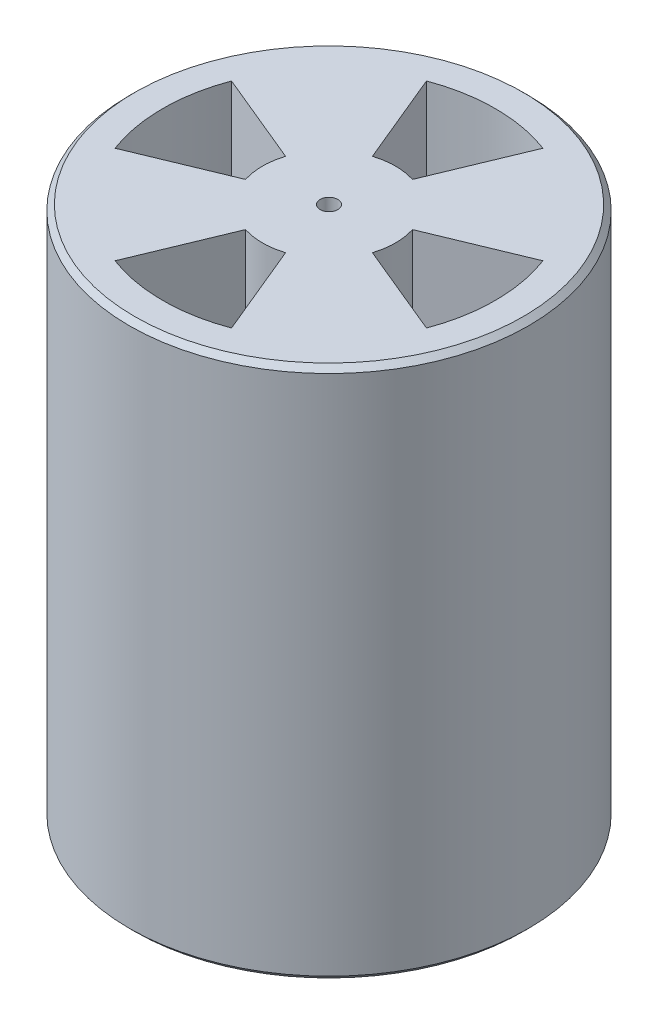
ISO-10303-21;
HEADER;
FILE_DESCRIPTION(('STEP AP214'),'2;1');
FILE_NAME('part.step','',(''),(''),'','','');
FILE_SCHEMA(('AUTOMOTIVE_DESIGN { 1 0 10303 214 1 1 1 1 }'));
ENDSEC;
DATA;
#1=APPLICATION_CONTEXT('core data for automotive mechanical design processes');
#2=APPLICATION_PROTOCOL_DEFINITION('international standard','automotive_design',2000,#1);
#3=PRODUCT_CONTEXT('',#1,'mechanical');
#4=PRODUCT('Part','Part','',(#3));
#5=PRODUCT_RELATED_PRODUCT_CATEGORY('part','',(#4));
#6=PRODUCT_DEFINITION_FORMATION('','',#4);
#7=PRODUCT_DEFINITION_CONTEXT('part definition',#1,'design');
#8=PRODUCT_DEFINITION('design','',#6,#7);
#9=PRODUCT_DEFINITION_SHAPE('','',#8);
#10=(LENGTH_UNIT() NAMED_UNIT(*) SI_UNIT(.MILLI.,.METRE.));
#11=(NAMED_UNIT(*) PLANE_ANGLE_UNIT() SI_UNIT($,.RADIAN.));
#12=(NAMED_UNIT(*) SI_UNIT($,.STERADIAN.) SOLID_ANGLE_UNIT());
#13=UNCERTAINTY_MEASURE_WITH_UNIT(LENGTH_MEASURE(1.E-05),#10,'distance_accuracy_value','');
#14=(GEOMETRIC_REPRESENTATION_CONTEXT(3) GLOBAL_UNCERTAINTY_ASSIGNED_CONTEXT((#13)) GLOBAL_UNIT_ASSIGNED_CONTEXT((#10,
#11,#12)) REPRESENTATION_CONTEXT('',''));
#15=CARTESIAN_POINT('',(0.,0.,0.));
#16=DIRECTION('',(0.,0.,1.));
#17=DIRECTION('',(1.,0.,0.));
#18=AXIS2_PLACEMENT_3D('',#15,#16,#17);
#19=CARTESIAN_POINT('',(0.,203.2,0.));
#20=DIRECTION('',(0.,1.,0.));
#21=DIRECTION('',(0.,0.,1.));
#22=AXIS2_PLACEMENT_3D('',#19,#20,#21);
#23=CYLINDRICAL_SURFACE('',#22,3.37819999999997);
#24=CARTESIAN_POINT('',(0.,203.2,0.));
#25=DIRECTION('',(0.,1.,0.));
#26=DIRECTION('',(0.,0.,1.));
#27=AXIS2_PLACEMENT_3D('',#24,#25,#26);
#28=CIRCLE('',#27,3.37819999999999);
#29=CARTESIAN_POINT('',(0.,203.2,3.37819999999999));
#30=VERTEX_POINT('',#29);
#31=EDGE_CURVE('E178',#30,#30,#28,.T.);
#32=ORIENTED_EDGE('',*,*,#31,.T.);
#33=EDGE_LOOP('',(#32));
#34=FACE_BOUND('',#33,.T.);
#35=CARTESIAN_POINT('',(0.,15.875,0.));
#36=DIRECTION('',(0.,-1.,0.));
#37=DIRECTION('',(0.,0.,-1.));
#38=AXIS2_PLACEMENT_3D('',#35,#36,#37);
#39=CIRCLE('',#38,3.37819999999997);
#40=CARTESIAN_POINT('',(0.,15.875,-3.37819999999997));
#41=VERTEX_POINT('',#40);
#42=EDGE_CURVE('E176',#41,#41,#39,.F.);
#43=ORIENTED_EDGE('',*,*,#42,.F.);
#44=EDGE_LOOP('',(#43));
#45=FACE_BOUND('',#44,.T.);
#46=ADVANCED_FACE('F40',(#34,#45),#23,.F.);
#47=CARTESIAN_POINT('',(0.,203.2,0.));
#48=DIRECTION('',(0.,-1.,0.));
#49=DIRECTION('',(0.,0.,-1.));
#50=AXIS2_PLACEMENT_3D('',#47,#48,#49);
#51=CYLINDRICAL_SURFACE('',#50,76.1365);
#52=CARTESIAN_POINT('',(0.,2.03199999999998,0.));
#53=DIRECTION('',(0.,1.,0.));
#54=DIRECTION('',(0.,0.,1.));
#55=AXIS2_PLACEMENT_3D('',#52,#53,#54);
#56=CIRCLE('',#55,76.1365);
#57=CARTESIAN_POINT('',(0.,2.03199999999998,76.1365));
#58=VERTEX_POINT('',#57);
#59=EDGE_CURVE('E190',#58,#58,#56,.T.);
#60=ORIENTED_EDGE('',*,*,#59,.T.);
#61=EDGE_LOOP('',(#60));
#62=FACE_BOUND('',#61,.T.);
#63=CARTESIAN_POINT('',(0.,201.168,0.));
#64=DIRECTION('',(0.,1.,0.));
#65=DIRECTION('',(0.,0.,1.));
#66=AXIS2_PLACEMENT_3D('',#63,#64,#65);
#67=CIRCLE('',#66,76.1365);
#68=CARTESIAN_POINT('',(0.,201.168,76.1365));
#69=VERTEX_POINT('',#68);
#70=EDGE_CURVE('E175',#69,#69,#67,.F.);
#71=ORIENTED_EDGE('',*,*,#70,.T.);
#72=EDGE_LOOP('',(#71));
#73=FACE_BOUND('',#72,.T.);
#74=ADVANCED_FACE('F280',(#62,#73),#51,.T.);
#75=CARTESIAN_POINT('',(0.,203.2,0.));
#76=DIRECTION('',(0.,1.,0.));
#77=DIRECTION('',(0.,0.,1.));
#78=AXIS2_PLACEMENT_3D('',#75,#76,#77);
#79=PLANE('',#78);
#80=ORIENTED_EDGE('',*,*,#31,.F.);
#81=EDGE_LOOP('',(#80));
#82=FACE_BOUND('',#81,.T.);
#83=CARTESIAN_POINT('',(0.,203.2,0.));
#84=DIRECTION('',(0.,1.,0.));
#85=DIRECTION('',(0.,0.,1.));
#86=AXIS2_PLACEMENT_3D('',#83,#84,#85);
#87=CIRCLE('',#86,25.4);
#88=CARTESIAN_POINT('',(-7.64705119977545,203.2,-24.2215319075407));
#89=VERTEX_POINT('',#88);
#90=CARTESIAN_POINT('',(7.64705119977543,203.2,-24.2215319075407));
#91=VERTEX_POINT('',#90);
#92=EDGE_CURVE('E173',#89,#91,#87,.F.);
#93=ORIENTED_EDGE('',*,*,#92,.F.);
#94=DIRECTION('',(0.38268343236509,0.,0.923879532511287));
#95=VECTOR('',#94,1.);
#96=CARTESIAN_POINT('',(-7.64705119977545,203.2,-24.2215319075407));
#97=LINE('',#96,#95);
#98=CARTESIAN_POINT('',(-22.225,203.2,-59.4158136126234));
#99=VERTEX_POINT('',#98);
#100=EDGE_CURVE('E85',#99,#89,#97,.T.);
#101=ORIENTED_EDGE('',*,*,#100,.F.);
#102=CARTESIAN_POINT('',(0.,203.2,0.));
#103=DIRECTION('',(0.,1.,0.));
#104=DIRECTION('',(0.,0.,1.));
#105=AXIS2_PLACEMENT_3D('',#102,#103,#104);
#106=CIRCLE('',#105,63.4365);
#107=CARTESIAN_POINT('',(22.225,203.2,-59.4158136126234));
#108=VERTEX_POINT('',#107);
#109=EDGE_CURVE('E167',#108,#99,#106,.T.);
#110=ORIENTED_EDGE('',*,*,#109,.F.);
#111=DIRECTION('',(0.382683432365091,0.,-0.923879532511286));
#112=VECTOR('',#111,1.);
#113=CARTESIAN_POINT('',(7.64705119977543,203.2,-24.2215319075407));
#114=LINE('',#113,#112);
#115=EDGE_CURVE('E165',#91,#108,#114,.T.);
#116=ORIENTED_EDGE('',*,*,#115,.F.);
#117=EDGE_LOOP('',(#93,#101,#110,#116));
#118=FACE_BOUND('',#117,.T.);
#119=CARTESIAN_POINT('',(0.,203.2,0.));
#120=DIRECTION('',(0.,1.,0.));
#121=DIRECTION('',(0.,0.,1.));
#122=AXIS2_PLACEMENT_3D('',#119,#120,#121);
#123=CIRCLE('',#122,25.4);
#124=CARTESIAN_POINT('',(24.2215319075407,203.2,-7.64705119977545));
#125=VERTEX_POINT('',#124);
#126=CARTESIAN_POINT('',(24.2215319075407,203.2,7.64705119977543));
#127=VERTEX_POINT('',#126);
#128=EDGE_CURVE('E152',#125,#127,#123,.F.);
#129=ORIENTED_EDGE('',*,*,#128,.F.);
#130=DIRECTION('',(-0.923879532511287,0.,0.38268343236509));
#131=VECTOR('',#130,1.);
#132=CARTESIAN_POINT('',(24.2215319075407,203.2,-7.64705119977545));
#133=LINE('',#132,#131);
#134=CARTESIAN_POINT('',(59.4158136126234,203.2,-22.225));
#135=VERTEX_POINT('',#134);
#136=EDGE_CURVE('E142',#135,#125,#133,.T.);
#137=ORIENTED_EDGE('',*,*,#136,.F.);
#138=CARTESIAN_POINT('',(0.,203.2,0.));
#139=DIRECTION('',(0.,1.,0.));
#140=DIRECTION('',(0.,0.,1.));
#141=AXIS2_PLACEMENT_3D('',#138,#139,#140);
#142=CIRCLE('',#141,63.4365);
#143=CARTESIAN_POINT('',(59.4158136126234,203.2,22.225));
#144=VERTEX_POINT('',#143);
#145=EDGE_CURVE('E136',#144,#135,#142,.T.);
#146=ORIENTED_EDGE('',*,*,#145,.F.);
#147=DIRECTION('',(0.923879532511286,0.,0.382683432365091));
#148=VECTOR('',#147,1.);
#149=CARTESIAN_POINT('',(24.2215319075407,203.2,7.64705119977543));
#150=LINE('',#149,#148);
#151=EDGE_CURVE('E164',#127,#144,#150,.T.);
#152=ORIENTED_EDGE('',*,*,#151,.F.);
#153=EDGE_LOOP('',(#129,#137,#146,#152));
#154=FACE_BOUND('',#153,.T.);
#155=CARTESIAN_POINT('',(0.,203.2,0.));
#156=DIRECTION('',(0.,1.,0.));
#157=DIRECTION('',(0.,0.,1.));
#158=AXIS2_PLACEMENT_3D('',#155,#156,#157);
#159=CIRCLE('',#158,25.4);
#160=CARTESIAN_POINT('',(7.64705119977545,203.2,24.2215319075407));
#161=VERTEX_POINT('',#160);
#162=CARTESIAN_POINT('',(-7.64705119977543,203.2,24.2215319075407));
#163=VERTEX_POINT('',#162);
#164=EDGE_CURVE('E210',#161,#163,#159,.F.);
#165=ORIENTED_EDGE('',*,*,#164,.F.);
#166=DIRECTION('',(-0.382683432365091,0.,-0.923879532511287));
#167=VECTOR('',#166,1.);
#168=CARTESIAN_POINT('',(7.64705119977545,203.2,24.2215319075407));
#169=LINE('',#168,#167);
#170=CARTESIAN_POINT('',(22.225,203.2,59.4158136126234));
#171=VERTEX_POINT('',#170);
#172=EDGE_CURVE('E208',#171,#161,#169,.T.);
#173=ORIENTED_EDGE('',*,*,#172,.F.);
#174=CARTESIAN_POINT('',(0.,203.2,0.));
#175=DIRECTION('',(0.,1.,0.));
#176=DIRECTION('',(0.,0.,1.));
#177=AXIS2_PLACEMENT_3D('',#174,#175,#176);
#178=CIRCLE('',#177,63.4365);
#179=CARTESIAN_POINT('',(-22.225,203.2,59.4158136126234));
#180=VERTEX_POINT('',#179);
#181=EDGE_CURVE('E206',#180,#171,#178,.T.);
#182=ORIENTED_EDGE('',*,*,#181,.F.);
#183=DIRECTION('',(-0.382683432365091,0.,0.923879532511286));
#184=VECTOR('',#183,1.);
#185=CARTESIAN_POINT('',(-7.64705119977543,203.2,24.2215319075407));
#186=LINE('',#185,#184);
#187=EDGE_CURVE('E204',#163,#180,#186,.T.);
#188=ORIENTED_EDGE('',*,*,#187,.F.);
#189=EDGE_LOOP('',(#165,#173,#182,#188));
#190=FACE_BOUND('',#189,.T.);
#191=CARTESIAN_POINT('',(0.,203.2,0.));
#192=DIRECTION('',(0.,1.,0.));
#193=DIRECTION('',(0.,0.,1.));
#194=AXIS2_PLACEMENT_3D('',#191,#192,#193);
#195=CIRCLE('',#194,25.4);
#196=CARTESIAN_POINT('',(-24.2215319075407,203.2,7.64705119977545));
#197=VERTEX_POINT('',#196);
#198=CARTESIAN_POINT('',(-24.2215319075407,203.2,-7.64705119977542));
#199=VERTEX_POINT('',#198);
#200=EDGE_CURVE('E201',#197,#199,#195,.F.);
#201=ORIENTED_EDGE('',*,*,#200,.F.);
#202=DIRECTION('',(0.923879532511287,0.,-0.382683432365091));
#203=VECTOR('',#202,1.);
#204=CARTESIAN_POINT('',(-24.2215319075407,203.2,7.64705119977545));
#205=LINE('',#204,#203);
#206=CARTESIAN_POINT('',(-59.4158136126234,203.2,22.225));
#207=VERTEX_POINT('',#206);
#208=EDGE_CURVE('E199',#207,#197,#205,.T.);
#209=ORIENTED_EDGE('',*,*,#208,.F.);
#210=CARTESIAN_POINT('',(0.,203.2,0.));
#211=DIRECTION('',(0.,1.,0.));
#212=DIRECTION('',(0.,0.,1.));
#213=AXIS2_PLACEMENT_3D('',#210,#211,#212);
#214=CIRCLE('',#213,63.4365);
#215=CARTESIAN_POINT('',(-59.4158136126234,203.2,-22.225));
#216=VERTEX_POINT('',#215);
#217=EDGE_CURVE('E196',#216,#207,#214,.T.);
#218=ORIENTED_EDGE('',*,*,#217,.F.);
#219=DIRECTION('',(-0.923879532511286,0.,-0.382683432365091));
#220=VECTOR('',#219,1.);
#221=CARTESIAN_POINT('',(-24.2215319075407,203.2,-7.64705119977542));
#222=LINE('',#221,#220);
#223=EDGE_CURVE('E194',#199,#216,#222,.T.);
#224=ORIENTED_EDGE('',*,*,#223,.F.);
#225=EDGE_LOOP('',(#201,#209,#218,#224));
#226=FACE_BOUND('',#225,.T.);
#227=CARTESIAN_POINT('',(0.,203.2,0.));
#228=DIRECTION('',(0.,1.,0.));
#229=DIRECTION('',(0.,0.,1.));
#230=AXIS2_PLACEMENT_3D('',#227,#228,#229);
#231=CIRCLE('',#230,74.1044999999999);
#232=CARTESIAN_POINT('',(0.,203.2,74.1044999999999));
#233=VERTEX_POINT('',#232);
#234=EDGE_CURVE('E181',#233,#233,#231,.T.);
#235=ORIENTED_EDGE('',*,*,#234,.T.);
#236=EDGE_LOOP('',(#235));
#237=FACE_BOUND('',#236,.T.);
#238=ADVANCED_FACE('F162',(#82,#118,#154,#190,#226,#237),#79,.T.);
#239=CARTESIAN_POINT('',(0.,0.,0.));
#240=DIRECTION('',(0.,1.,0.));
#241=DIRECTION('',(0.,0.,1.));
#242=AXIS2_PLACEMENT_3D('',#239,#240,#241);
#243=PLANE('',#242);
#244=CARTESIAN_POINT('',(0.,0.,0.));
#245=DIRECTION('',(0.,1.,0.));
#246=DIRECTION('',(0.,0.,1.));
#247=AXIS2_PLACEMENT_3D('',#244,#245,#246);
#248=CIRCLE('',#247,18.415);
#249=CARTESIAN_POINT('',(0.,0.,18.415));
#250=VERTEX_POINT('',#249);
#251=EDGE_CURVE('E11',#250,#250,#248,.T.);
#252=ORIENTED_EDGE('',*,*,#251,.T.);
#253=EDGE_LOOP('',(#252));
#254=FACE_BOUND('',#253,.T.);
#255=DIRECTION('',(0.38268343236509,0.,0.923879532511286));
#256=VECTOR('',#255,1.);
#257=CARTESIAN_POINT('',(-7.64705119977545,0.,-24.2215319075407));
#258=LINE('',#257,#256);
#259=CARTESIAN_POINT('',(-22.225,0.,-59.4158136126234));
#260=VERTEX_POINT('',#259);
#261=CARTESIAN_POINT('',(-7.64705119977545,0.,-24.2215319075407));
#262=VERTEX_POINT('',#261);
#263=EDGE_CURVE('E384',#260,#262,#258,.T.);
#264=ORIENTED_EDGE('',*,*,#263,.T.);
#265=CARTESIAN_POINT('',(0.,0.,0.));
#266=DIRECTION('',(0.,-1.,0.));
#267=DIRECTION('',(0.,0.,1.));
#268=AXIS2_PLACEMENT_3D('',#265,#266,#267);
#269=CIRCLE('',#268,25.4);
#270=CARTESIAN_POINT('',(7.64705119977543,0.,-24.2215319075407));
#271=VERTEX_POINT('',#270);
#272=EDGE_CURVE('E233',#262,#271,#269,.T.);
#273=ORIENTED_EDGE('',*,*,#272,.T.);
#274=DIRECTION('',(0.382683432365091,0.,-0.923879532511286));
#275=VECTOR('',#274,1.);
#276=CARTESIAN_POINT('',(7.64705119977543,0.,-24.2215319075407));
#277=LINE('',#276,#275);
#278=CARTESIAN_POINT('',(22.225,0.,-59.4158136126234));
#279=VERTEX_POINT('',#278);
#280=EDGE_CURVE('E389',#271,#279,#277,.T.);
#281=ORIENTED_EDGE('',*,*,#280,.T.);
#282=CARTESIAN_POINT('',(0.,0.,0.));
#283=DIRECTION('',(0.,1.,0.));
#284=DIRECTION('',(0.,0.,1.));
#285=AXIS2_PLACEMENT_3D('',#282,#283,#284);
#286=CIRCLE('',#285,63.4365);
#287=EDGE_CURVE('E386',#279,#260,#286,.T.);
#288=ORIENTED_EDGE('',*,*,#287,.T.);
#289=EDGE_LOOP('',(#264,#273,#281,#288));
#290=FACE_BOUND('',#289,.T.);
#291=DIRECTION('',(-0.923879532511286,0.,0.38268343236509));
#292=VECTOR('',#291,1.);
#293=CARTESIAN_POINT('',(24.2215319075407,0.,-7.64705119977545));
#294=LINE('',#293,#292);
#295=CARTESIAN_POINT('',(59.4158136126234,0.,-22.225));
#296=VERTEX_POINT('',#295);
#297=CARTESIAN_POINT('',(24.2215319075407,0.,-7.64705119977545));
#298=VERTEX_POINT('',#297);
#299=EDGE_CURVE('E221',#296,#298,#294,.T.);
#300=ORIENTED_EDGE('',*,*,#299,.T.);
#301=CARTESIAN_POINT('',(0.,0.,0.));
#302=DIRECTION('',(0.,-1.,0.));
#303=DIRECTION('',(0.,0.,1.));
#304=AXIS2_PLACEMENT_3D('',#301,#302,#303);
#305=CIRCLE('',#304,25.4);
#306=CARTESIAN_POINT('',(24.2215319075407,0.,7.64705119977543));
#307=VERTEX_POINT('',#306);
#308=EDGE_CURVE('E158',#298,#307,#305,.T.);
#309=ORIENTED_EDGE('',*,*,#308,.T.);
#310=DIRECTION('',(0.923879532511286,0.,0.382683432365091));
#311=VECTOR('',#310,1.);
#312=CARTESIAN_POINT('',(24.2215319075407,0.,7.64705119977543));
#313=LINE('',#312,#311);
#314=CARTESIAN_POINT('',(59.4158136126234,0.,22.225));
#315=VERTEX_POINT('',#314);
#316=EDGE_CURVE('E230',#307,#315,#313,.T.);
#317=ORIENTED_EDGE('',*,*,#316,.T.);
#318=CARTESIAN_POINT('',(0.,0.,0.));
#319=DIRECTION('',(0.,1.,0.));
#320=DIRECTION('',(0.,0.,1.));
#321=AXIS2_PLACEMENT_3D('',#318,#319,#320);
#322=CIRCLE('',#321,63.4365);
#323=EDGE_CURVE('E219',#315,#296,#322,.T.);
#324=ORIENTED_EDGE('',*,*,#323,.T.);
#325=EDGE_LOOP('',(#300,#309,#317,#324));
#326=FACE_BOUND('',#325,.T.);
#327=DIRECTION('',(-0.38268343236509,0.,-0.923879532511286));
#328=VECTOR('',#327,1.);
#329=CARTESIAN_POINT('',(7.64705119977545,0.,24.2215319075407));
#330=LINE('',#329,#328);
#331=CARTESIAN_POINT('',(22.225,0.,59.4158136126234));
#332=VERTEX_POINT('',#331);
#333=CARTESIAN_POINT('',(7.64705119977545,0.,24.2215319075407));
#334=VERTEX_POINT('',#333);
#335=EDGE_CURVE('E240',#332,#334,#330,.T.);
#336=ORIENTED_EDGE('',*,*,#335,.T.);
#337=CARTESIAN_POINT('',(0.,0.,0.));
#338=DIRECTION('',(0.,-1.,0.));
#339=DIRECTION('',(0.,0.,1.));
#340=AXIS2_PLACEMENT_3D('',#337,#338,#339);
#341=CIRCLE('',#340,25.4);
#342=CARTESIAN_POINT('',(-7.64705119977543,0.,24.2215319075407));
#343=VERTEX_POINT('',#342);
#344=EDGE_CURVE('E160',#334,#343,#341,.T.);
#345=ORIENTED_EDGE('',*,*,#344,.T.);
#346=DIRECTION('',(-0.382683432365091,0.,0.923879532511286));
#347=VECTOR('',#346,1.);
#348=CARTESIAN_POINT('',(-7.64705119977543,0.,24.2215319075407));
#349=LINE('',#348,#347);
#350=CARTESIAN_POINT('',(-22.225,0.,59.4158136126234));
#351=VERTEX_POINT('',#350);
#352=EDGE_CURVE('E252',#343,#351,#349,.T.);
#353=ORIENTED_EDGE('',*,*,#352,.T.);
#354=CARTESIAN_POINT('',(0.,0.,0.));
#355=DIRECTION('',(0.,1.,0.));
#356=DIRECTION('',(0.,0.,1.));
#357=AXIS2_PLACEMENT_3D('',#354,#355,#356);
#358=CIRCLE('',#357,63.4365);
#359=EDGE_CURVE('E249',#351,#332,#358,.T.);
#360=ORIENTED_EDGE('',*,*,#359,.T.);
#361=EDGE_LOOP('',(#336,#345,#353,#360));
#362=FACE_BOUND('',#361,.T.);
#363=DIRECTION('',(0.923879532511286,0.,-0.38268343236509));
#364=VECTOR('',#363,1.);
#365=CARTESIAN_POINT('',(-24.2215319075407,0.,7.64705119977545));
#366=LINE('',#365,#364);
#367=CARTESIAN_POINT('',(-59.4158136126234,0.,22.225));
#368=VERTEX_POINT('',#367);
#369=CARTESIAN_POINT('',(-24.2215319075407,0.,7.64705119977545));
#370=VERTEX_POINT('',#369);
#371=EDGE_CURVE('E262',#368,#370,#366,.T.);
#372=ORIENTED_EDGE('',*,*,#371,.T.);
#373=CARTESIAN_POINT('',(0.,0.,0.));
#374=DIRECTION('',(0.,-1.,0.));
#375=DIRECTION('',(0.,0.,1.));
#376=AXIS2_PLACEMENT_3D('',#373,#374,#375);
#377=CIRCLE('',#376,25.4);
#378=CARTESIAN_POINT('',(-24.2215319075407,0.,-7.64705119977542));
#379=VERTEX_POINT('',#378);
#380=EDGE_CURVE('E244',#370,#379,#377,.T.);
#381=ORIENTED_EDGE('',*,*,#380,.T.);
#382=DIRECTION('',(-0.923879532511286,0.,-0.382683432365091));
#383=VECTOR('',#382,1.);
#384=CARTESIAN_POINT('',(-24.2215319075407,0.,-7.64705119977542));
#385=LINE('',#384,#383);
#386=CARTESIAN_POINT('',(-59.4158136126234,0.,-22.225));
#387=VERTEX_POINT('',#386);
#388=EDGE_CURVE('E271',#379,#387,#385,.T.);
#389=ORIENTED_EDGE('',*,*,#388,.T.);
#390=CARTESIAN_POINT('',(0.,0.,0.));
#391=DIRECTION('',(0.,1.,0.));
#392=DIRECTION('',(0.,0.,1.));
#393=AXIS2_PLACEMENT_3D('',#390,#391,#392);
#394=CIRCLE('',#393,63.4365);
#395=EDGE_CURVE('E94',#387,#368,#394,.T.);
#396=ORIENTED_EDGE('',*,*,#395,.T.);
#397=EDGE_LOOP('',(#372,#381,#389,#396));
#398=FACE_BOUND('',#397,.T.);
#399=CARTESIAN_POINT('',(0.,0.,0.));
#400=DIRECTION('',(0.,1.,0.));
#401=DIRECTION('',(0.,0.,1.));
#402=AXIS2_PLACEMENT_3D('',#399,#400,#401);
#403=CIRCLE('',#402,74.1045);
#404=CARTESIAN_POINT('',(0.,0.,74.1045));
#405=VERTEX_POINT('',#404);
#406=EDGE_CURVE('E185',#405,#405,#403,.F.);
#407=ORIENTED_EDGE('',*,*,#406,.T.);
#408=EDGE_LOOP('',(#407));
#409=FACE_BOUND('',#408,.T.);
#410=ADVANCED_FACE('F286',(#254,#290,#326,#362,#398,#409),#243,.F.);
#411=CARTESIAN_POINT('',(0.,2.03199999999998,0.));
#412=DIRECTION('',(0.,1.,0.));
#413=DIRECTION('',(0.,0.,1.));
#414=AXIS2_PLACEMENT_3D('',#411,#412,#413);
#415=CONICAL_SURFACE('',#414,76.1365,0.785398163397455);
#416=ORIENTED_EDGE('',*,*,#406,.F.);
#417=EDGE_LOOP('',(#416));
#418=FACE_BOUND('',#417,.T.);
#419=ORIENTED_EDGE('',*,*,#59,.F.);
#420=EDGE_LOOP('',(#419));
#421=FACE_BOUND('',#420,.T.);
#422=ADVANCED_FACE('F283',(#418,#421),#415,.T.);
#423=CARTESIAN_POINT('',(0.,203.2,0.));
#424=DIRECTION('',(0.,-1.,0.));
#425=DIRECTION('',(0.,0.,-1.));
#426=AXIS2_PLACEMENT_3D('',#423,#424,#425);
#427=CONICAL_SURFACE('',#426,74.1044999999999,0.785398163397448);
#428=ORIENTED_EDGE('',*,*,#70,.F.);
#429=EDGE_LOOP('',(#428));
#430=FACE_BOUND('',#429,.T.);
#431=ORIENTED_EDGE('',*,*,#234,.F.);
#432=EDGE_LOOP('',(#431));
#433=FACE_BOUND('',#432,.T.);
#434=ADVANCED_FACE('F285',(#430,#433),#427,.T.);
#435=CARTESIAN_POINT('',(0.,0.,0.));
#436=DIRECTION('',(0.,1.,0.));
#437=DIRECTION('',(0.,0.,1.));
#438=AXIS2_PLACEMENT_3D('',#435,#436,#437);
#439=CYLINDRICAL_SURFACE('',#438,25.4);
#440=ORIENTED_EDGE('',*,*,#200,.T.);
#441=DIRECTION('',(0.,1.,0.));
#442=VECTOR('',#441,1.);
#443=CARTESIAN_POINT('',(-24.2215319075407,0.,-7.64705119977542));
#444=LINE('',#443,#442);
#445=EDGE_CURVE('E259',#379,#199,#444,.T.);
#446=ORIENTED_EDGE('',*,*,#445,.F.);
#447=ORIENTED_EDGE('',*,*,#380,.F.);
#448=DIRECTION('',(0.,1.,0.));
#449=VECTOR('',#448,1.);
#450=CARTESIAN_POINT('',(-24.2215319075407,0.,7.64705119977545));
#451=LINE('',#450,#449);
#452=EDGE_CURVE('E263',#370,#197,#451,.T.);
#453=ORIENTED_EDGE('',*,*,#452,.T.);
#454=EDGE_LOOP('',(#440,#446,#447,#453));
#455=FACE_BOUND('',#454,.T.);
#456=ADVANCED_FACE('F293',(#455),#439,.T.);
#457=CARTESIAN_POINT('',(-24.2215319075407,0.,7.64705119977545));
#458=DIRECTION('',(0.38268343236509,0.,0.923879532511286));
#459=DIRECTION('',(0.923879532511287,0.,-0.382683432365091));
#460=AXIS2_PLACEMENT_3D('',#457,#458,#459);
#461=PLANE('',#460);
#462=ORIENTED_EDGE('',*,*,#208,.T.);
#463=ORIENTED_EDGE('',*,*,#452,.F.);
#464=ORIENTED_EDGE('',*,*,#371,.F.);
#465=DIRECTION('',(0.,1.,0.));
#466=VECTOR('',#465,1.);
#467=CARTESIAN_POINT('',(-59.4158136126234,0.,22.225));
#468=LINE('',#467,#466);
#469=EDGE_CURVE('E260',#368,#207,#468,.T.);
#470=ORIENTED_EDGE('',*,*,#469,.T.);
#471=EDGE_LOOP('',(#462,#463,#464,#470));
#472=FACE_BOUND('',#471,.T.);
#473=ADVANCED_FACE('F356',(#472),#461,.F.);
#474=CARTESIAN_POINT('',(0.,0.,0.));
#475=DIRECTION('',(0.,1.,0.));
#476=DIRECTION('',(0.,0.,1.));
#477=AXIS2_PLACEMENT_3D('',#474,#475,#476);
#478=CYLINDRICAL_SURFACE('',#477,63.4365);
#479=ORIENTED_EDGE('',*,*,#217,.T.);
#480=ORIENTED_EDGE('',*,*,#469,.F.);
#481=ORIENTED_EDGE('',*,*,#395,.F.);
#482=DIRECTION('',(0.,1.,0.));
#483=VECTOR('',#482,1.);
#484=CARTESIAN_POINT('',(-59.4158136126234,0.,-22.225));
#485=LINE('',#484,#483);
#486=EDGE_CURVE('E257',#387,#216,#485,.T.);
#487=ORIENTED_EDGE('',*,*,#486,.T.);
#488=EDGE_LOOP('',(#479,#480,#481,#487));
#489=FACE_BOUND('',#488,.T.);
#490=ADVANCED_FACE('F360',(#489),#478,.F.);
#491=CARTESIAN_POINT('',(-24.2215319075407,0.,-7.64705119977542));
#492=DIRECTION('',(0.382683432365091,0.,-0.923879532511286));
#493=DIRECTION('',(-0.923879532511286,0.,-0.382683432365091));
#494=AXIS2_PLACEMENT_3D('',#491,#492,#493);
#495=PLANE('',#494);
#496=ORIENTED_EDGE('',*,*,#223,.T.);
#497=ORIENTED_EDGE('',*,*,#486,.F.);
#498=ORIENTED_EDGE('',*,*,#388,.F.);
#499=ORIENTED_EDGE('',*,*,#445,.T.);
#500=EDGE_LOOP('',(#496,#497,#498,#499));
#501=FACE_BOUND('',#500,.T.);
#502=ADVANCED_FACE('F342',(#501),#495,.F.);
#503=CARTESIAN_POINT('',(0.,0.,0.));
#504=DIRECTION('',(0.,1.,0.));
#505=DIRECTION('',(0.,0.,1.));
#506=AXIS2_PLACEMENT_3D('',#503,#504,#505);
#507=CYLINDRICAL_SURFACE('',#506,25.4);
#508=ORIENTED_EDGE('',*,*,#164,.T.);
#509=DIRECTION('',(0.,1.,0.));
#510=VECTOR('',#509,1.);
#511=CARTESIAN_POINT('',(-7.64705119977543,0.,24.2215319075407));
#512=LINE('',#511,#510);
#513=EDGE_CURVE('E237',#343,#163,#512,.T.);
#514=ORIENTED_EDGE('',*,*,#513,.F.);
#515=ORIENTED_EDGE('',*,*,#344,.F.);
#516=DIRECTION('',(0.,1.,0.));
#517=VECTOR('',#516,1.);
#518=CARTESIAN_POINT('',(7.64705119977545,0.,24.2215319075407));
#519=LINE('',#518,#517);
#520=EDGE_CURVE('E241',#334,#161,#519,.T.);
#521=ORIENTED_EDGE('',*,*,#520,.T.);
#522=EDGE_LOOP('',(#508,#514,#515,#521));
#523=FACE_BOUND('',#522,.T.);
#524=ADVANCED_FACE('F338',(#523),#507,.T.);
#525=CARTESIAN_POINT('',(7.64705119977545,0.,24.2215319075407));
#526=DIRECTION('',(0.923879532511286,0.,-0.38268343236509));
#527=DIRECTION('',(-0.382683432365091,0.,-0.923879532511287));
#528=AXIS2_PLACEMENT_3D('',#525,#526,#527);
#529=PLANE('',#528);
#530=ORIENTED_EDGE('',*,*,#172,.T.);
#531=ORIENTED_EDGE('',*,*,#520,.F.);
#532=ORIENTED_EDGE('',*,*,#335,.F.);
#533=DIRECTION('',(0.,1.,0.));
#534=VECTOR('',#533,1.);
#535=CARTESIAN_POINT('',(22.225,0.,59.4158136126234));
#536=LINE('',#535,#534);
#537=EDGE_CURVE('E238',#332,#171,#536,.T.);
#538=ORIENTED_EDGE('',*,*,#537,.T.);
#539=EDGE_LOOP('',(#530,#531,#532,#538));
#540=FACE_BOUND('',#539,.T.);
#541=ADVANCED_FACE('F341',(#540),#529,.F.);
#542=CARTESIAN_POINT('',(0.,0.,0.));
#543=DIRECTION('',(0.,1.,0.));
#544=DIRECTION('',(0.,0.,1.));
#545=AXIS2_PLACEMENT_3D('',#542,#543,#544);
#546=CYLINDRICAL_SURFACE('',#545,63.4365);
#547=ORIENTED_EDGE('',*,*,#181,.T.);
#548=ORIENTED_EDGE('',*,*,#537,.F.);
#549=ORIENTED_EDGE('',*,*,#359,.F.);
#550=DIRECTION('',(0.,1.,0.));
#551=VECTOR('',#550,1.);
#552=CARTESIAN_POINT('',(-22.225,0.,59.4158136126233));
#553=LINE('',#552,#551);
#554=EDGE_CURVE('E234',#351,#180,#553,.T.);
#555=ORIENTED_EDGE('',*,*,#554,.T.);
#556=EDGE_LOOP('',(#547,#548,#549,#555));
#557=FACE_BOUND('',#556,.T.);
#558=ADVANCED_FACE('F346',(#557),#546,.F.);
#559=CARTESIAN_POINT('',(-7.64705119977543,0.,24.2215319075407));
#560=DIRECTION('',(-0.923879532511286,0.,-0.382683432365091));
#561=DIRECTION('',(-0.382683432365091,0.,0.923879532511286));
#562=AXIS2_PLACEMENT_3D('',#559,#560,#561);
#563=PLANE('',#562);
#564=ORIENTED_EDGE('',*,*,#187,.T.);
#565=ORIENTED_EDGE('',*,*,#554,.F.);
#566=ORIENTED_EDGE('',*,*,#352,.F.);
#567=ORIENTED_EDGE('',*,*,#513,.T.);
#568=EDGE_LOOP('',(#564,#565,#566,#567));
#569=FACE_BOUND('',#568,.T.);
#570=ADVANCED_FACE('F331',(#569),#563,.F.);
#571=CARTESIAN_POINT('',(0.,0.,0.));
#572=DIRECTION('',(0.,1.,0.));
#573=DIRECTION('',(0.,0.,1.));
#574=AXIS2_PLACEMENT_3D('',#571,#572,#573);
#575=CYLINDRICAL_SURFACE('',#574,25.4);
#576=ORIENTED_EDGE('',*,*,#128,.T.);
#577=DIRECTION('',(0.,1.,0.));
#578=VECTOR('',#577,1.);
#579=CARTESIAN_POINT('',(24.2215319075407,0.,7.64705119977543));
#580=LINE('',#579,#578);
#581=EDGE_CURVE('E65',#307,#127,#580,.T.);
#582=ORIENTED_EDGE('',*,*,#581,.F.);
#583=ORIENTED_EDGE('',*,*,#308,.F.);
#584=DIRECTION('',(0.,1.,0.));
#585=VECTOR('',#584,1.);
#586=CARTESIAN_POINT('',(24.2215319075407,0.,-7.64705119977545));
#587=LINE('',#586,#585);
#588=EDGE_CURVE('E147',#298,#125,#587,.T.);
#589=ORIENTED_EDGE('',*,*,#588,.T.);
#590=EDGE_LOOP('',(#576,#582,#583,#589));
#591=FACE_BOUND('',#590,.T.);
#592=ADVANCED_FACE('F155',(#591),#575,.T.);
#593=CARTESIAN_POINT('',(24.2215319075407,0.,-7.64705119977545));
#594=DIRECTION('',(-0.38268343236509,0.,-0.923879532511286));
#595=DIRECTION('',(-0.923879532511287,0.,0.38268343236509));
#596=AXIS2_PLACEMENT_3D('',#593,#594,#595);
#597=PLANE('',#596);
#598=ORIENTED_EDGE('',*,*,#136,.T.);
#599=ORIENTED_EDGE('',*,*,#588,.F.);
#600=ORIENTED_EDGE('',*,*,#299,.F.);
#601=DIRECTION('',(0.,1.,0.));
#602=VECTOR('',#601,1.);
#603=CARTESIAN_POINT('',(59.4158136126234,0.,-22.225));
#604=LINE('',#603,#602);
#605=EDGE_CURVE('E149',#296,#135,#604,.T.);
#606=ORIENTED_EDGE('',*,*,#605,.T.);
#607=EDGE_LOOP('',(#598,#599,#600,#606));
#608=FACE_BOUND('',#607,.T.);
#609=ADVANCED_FACE('F144',(#608),#597,.F.);
#610=CARTESIAN_POINT('',(0.,0.,0.));
#611=DIRECTION('',(0.,1.,0.));
#612=DIRECTION('',(0.,0.,1.));
#613=AXIS2_PLACEMENT_3D('',#610,#611,#612);
#614=CYLINDRICAL_SURFACE('',#613,63.4365);
#615=ORIENTED_EDGE('',*,*,#145,.T.);
#616=ORIENTED_EDGE('',*,*,#605,.F.);
#617=ORIENTED_EDGE('',*,*,#323,.F.);
#618=DIRECTION('',(0.,1.,0.));
#619=VECTOR('',#618,1.);
#620=CARTESIAN_POINT('',(59.4158136126234,0.,22.225));
#621=LINE('',#620,#619);
#622=EDGE_CURVE('E215',#315,#144,#621,.T.);
#623=ORIENTED_EDGE('',*,*,#622,.T.);
#624=EDGE_LOOP('',(#615,#616,#617,#623));
#625=FACE_BOUND('',#624,.T.);
#626=ADVANCED_FACE('F217',(#625),#614,.F.);
#627=CARTESIAN_POINT('',(24.2215319075407,0.,7.64705119977543));
#628=DIRECTION('',(-0.382683432365091,0.,0.923879532511286));
#629=DIRECTION('',(0.923879532511286,0.,0.382683432365091));
#630=AXIS2_PLACEMENT_3D('',#627,#628,#629);
#631=PLANE('',#630);
#632=ORIENTED_EDGE('',*,*,#151,.T.);
#633=ORIENTED_EDGE('',*,*,#622,.F.);
#634=ORIENTED_EDGE('',*,*,#316,.F.);
#635=ORIENTED_EDGE('',*,*,#581,.T.);
#636=EDGE_LOOP('',(#632,#633,#634,#635));
#637=FACE_BOUND('',#636,.T.);
#638=ADVANCED_FACE('F214',(#637),#631,.F.);
#639=CARTESIAN_POINT('',(0.,0.,0.));
#640=DIRECTION('',(0.,1.,0.));
#641=DIRECTION('',(0.,0.,1.));
#642=AXIS2_PLACEMENT_3D('',#639,#640,#641);
#643=CYLINDRICAL_SURFACE('',#642,25.4);
#644=ORIENTED_EDGE('',*,*,#92,.T.);
#645=DIRECTION('',(0.,1.,0.));
#646=VECTOR('',#645,1.);
#647=CARTESIAN_POINT('',(7.64705119977543,0.,-24.2215319075407));
#648=LINE('',#647,#646);
#649=EDGE_CURVE('E56',#271,#91,#648,.T.);
#650=ORIENTED_EDGE('',*,*,#649,.F.);
#651=ORIENTED_EDGE('',*,*,#272,.F.);
#652=DIRECTION('',(0.,1.,0.));
#653=VECTOR('',#652,1.);
#654=CARTESIAN_POINT('',(-7.64705119977545,0.,-24.2215319075407));
#655=LINE('',#654,#653);
#656=EDGE_CURVE('E197',#262,#89,#655,.T.);
#657=ORIENTED_EDGE('',*,*,#656,.T.);
#658=EDGE_LOOP('',(#644,#650,#651,#657));
#659=FACE_BOUND('',#658,.T.);
#660=ADVANCED_FACE('F318',(#659),#643,.T.);
#661=CARTESIAN_POINT('',(-7.64705119977545,0.,-24.2215319075407));
#662=DIRECTION('',(-0.923879532511286,0.,0.38268343236509));
#663=DIRECTION('',(0.38268343236509,0.,0.923879532511287));
#664=AXIS2_PLACEMENT_3D('',#661,#662,#663);
#665=PLANE('',#664);
#666=ORIENTED_EDGE('',*,*,#100,.T.);
#667=ORIENTED_EDGE('',*,*,#656,.F.);
#668=ORIENTED_EDGE('',*,*,#263,.F.);
#669=DIRECTION('',(0.,1.,0.));
#670=VECTOR('',#669,1.);
#671=CARTESIAN_POINT('',(-22.225,0.,-59.4158136126234));
#672=LINE('',#671,#670);
#673=EDGE_CURVE('E380',#260,#99,#672,.T.);
#674=ORIENTED_EDGE('',*,*,#673,.T.);
#675=EDGE_LOOP('',(#666,#667,#668,#674));
#676=FACE_BOUND('',#675,.T.);
#677=ADVANCED_FACE('F314',(#676),#665,.F.);
#678=CARTESIAN_POINT('',(0.,0.,0.));
#679=DIRECTION('',(0.,1.,0.));
#680=DIRECTION('',(0.,0.,1.));
#681=AXIS2_PLACEMENT_3D('',#678,#679,#680);
#682=CYLINDRICAL_SURFACE('',#681,63.4365);
#683=ORIENTED_EDGE('',*,*,#109,.T.);
#684=ORIENTED_EDGE('',*,*,#673,.F.);
#685=ORIENTED_EDGE('',*,*,#287,.F.);
#686=DIRECTION('',(0.,1.,0.));
#687=VECTOR('',#686,1.);
#688=CARTESIAN_POINT('',(22.225,0.,-59.4158136126234));
#689=LINE('',#688,#687);
#690=EDGE_CURVE('E225',#279,#108,#689,.T.);
#691=ORIENTED_EDGE('',*,*,#690,.T.);
#692=EDGE_LOOP('',(#683,#684,#685,#691));
#693=FACE_BOUND('',#692,.T.);
#694=ADVANCED_FACE('F317',(#693),#682,.F.);
#695=CARTESIAN_POINT('',(7.64705119977543,0.,-24.2215319075407));
#696=DIRECTION('',(0.923879532511286,0.,0.382683432365091));
#697=DIRECTION('',(0.382683432365091,0.,-0.923879532511286));
#698=AXIS2_PLACEMENT_3D('',#695,#696,#697);
#699=PLANE('',#698);
#700=ORIENTED_EDGE('',*,*,#115,.T.);
#701=ORIENTED_EDGE('',*,*,#690,.F.);
#702=ORIENTED_EDGE('',*,*,#280,.F.);
#703=ORIENTED_EDGE('',*,*,#649,.T.);
#704=EDGE_LOOP('',(#700,#701,#702,#703));
#705=FACE_BOUND('',#704,.T.);
#706=ADVANCED_FACE('F321',(#705),#699,.F.);
#707=CARTESIAN_POINT('',(0.,15.875,0.));
#708=DIRECTION('',(0.,-1.,0.));
#709=DIRECTION('',(0.,0.,-1.));
#710=AXIS2_PLACEMENT_3D('',#707,#708,#709);
#711=PLANE('',#710);
#712=CARTESIAN_POINT('',(0.,15.875,0.));
#713=DIRECTION('',(0.,-1.,0.));
#714=DIRECTION('',(0.,0.,-1.));
#715=AXIS2_PLACEMENT_3D('',#712,#713,#714);
#716=CIRCLE('',#715,15.875);
#717=CARTESIAN_POINT('',(0.,15.875,-15.875));
#718=VERTEX_POINT('',#717);
#719=EDGE_CURVE('E179',#718,#718,#716,.T.);
#720=ORIENTED_EDGE('',*,*,#719,.T.);
#721=EDGE_LOOP('',(#720));
#722=FACE_BOUND('',#721,.T.);
#723=ORIENTED_EDGE('',*,*,#42,.T.);
#724=EDGE_LOOP('',(#723));
#725=FACE_BOUND('',#724,.T.);
#726=ADVANCED_FACE('F325',(#722,#725),#711,.T.);
#727=CARTESIAN_POINT('',(0.,15.875,0.));
#728=DIRECTION('',(0.,-1.,0.));
#729=DIRECTION('',(0.,0.,-1.));
#730=AXIS2_PLACEMENT_3D('',#727,#728,#729);
#731=CYLINDRICAL_SURFACE('',#730,15.875);
#732=CARTESIAN_POINT('',(0.,2.53999999999996,0.));
#733=DIRECTION('',(0.,1.,0.));
#734=DIRECTION('',(0.,0.,1.));
#735=AXIS2_PLACEMENT_3D('',#732,#733,#734);
#736=CIRCLE('',#735,15.875);
#737=CARTESIAN_POINT('',(0.,2.53999999999996,15.875));
#738=VERTEX_POINT('',#737);
#739=EDGE_CURVE('E49',#738,#738,#736,.F.);
#740=ORIENTED_EDGE('',*,*,#739,.T.);
#741=EDGE_LOOP('',(#740));
#742=FACE_BOUND('',#741,.T.);
#743=ORIENTED_EDGE('',*,*,#719,.F.);
#744=EDGE_LOOP('',(#743));
#745=FACE_BOUND('',#744,.T.);
#746=ADVANCED_FACE('F312',(#742,#745),#731,.F.);
#747=CARTESIAN_POINT('',(0.,2.53999999999996,0.));
#748=DIRECTION('',(0.,-1.,0.));
#749=DIRECTION('',(0.,0.,-1.));
#750=AXIS2_PLACEMENT_3D('',#747,#748,#749);
#751=CONICAL_SURFACE('',#750,15.875,0.785398163397448);
#752=ORIENTED_EDGE('',*,*,#251,.F.);
#753=EDGE_LOOP('',(#752));
#754=FACE_BOUND('',#753,.T.);
#755=ORIENTED_EDGE('',*,*,#739,.F.);
#756=EDGE_LOOP('',(#755));
#757=FACE_BOUND('',#756,.T.);
#758=ADVANCED_FACE('F43',(#754,#757),#751,.F.);
#759=CLOSED_SHELL('',(#46,#74,#238,#410,#422,#434,#456,#473,#490,#502,#524,#541,#558,#570,#592,
#609,#626,#638,#660,#677,#694,#706,#726,#746,#758));
#760=MANIFOLD_SOLID_BREP('B2',#759);
#761=ADVANCED_BREP_SHAPE_REPRESENTATION('',(#18,#760),#14);
#762=SHAPE_DEFINITION_REPRESENTATION(#9,#761);
ENDSEC;
END-ISO-10303-21;
